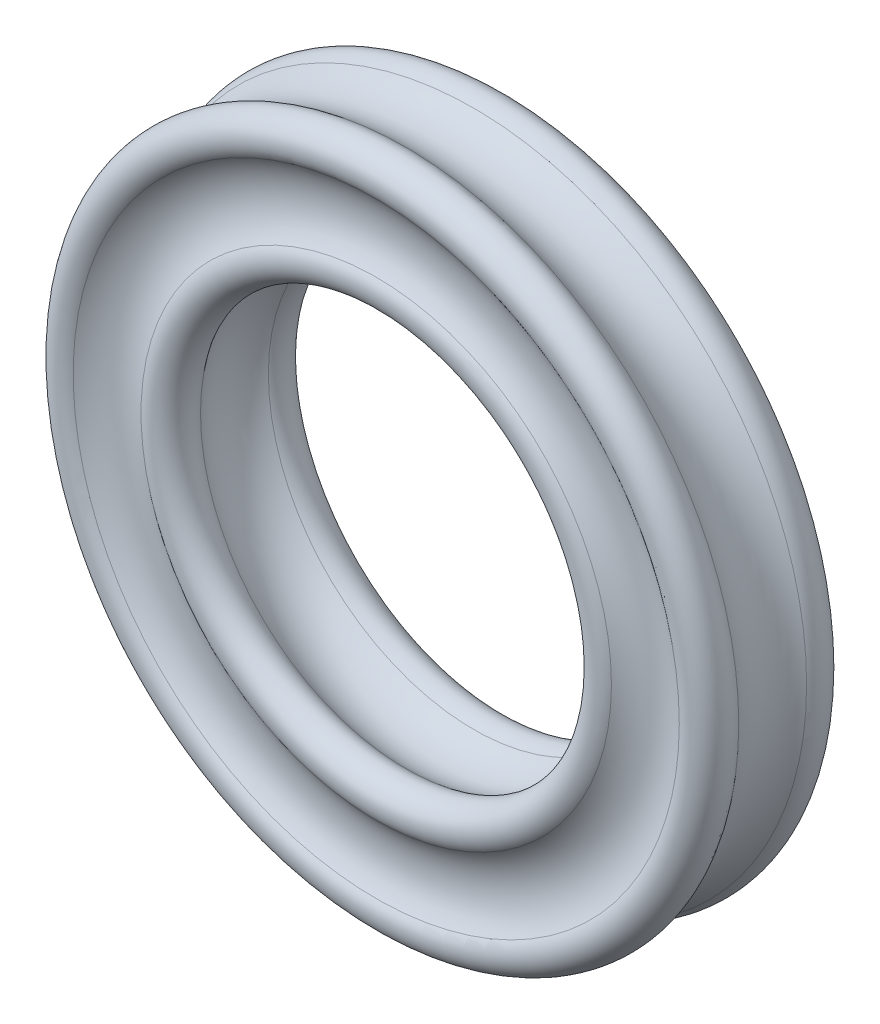
ISO-10303-21;
HEADER;
FILE_DESCRIPTION(('STEP AP214'),'2;1');
FILE_NAME('part.step','',(''),(''),'','','');
FILE_SCHEMA(('AUTOMOTIVE_DESIGN { 1 0 10303 214 1 1 1 1 }'));
ENDSEC;
DATA;
#1=APPLICATION_CONTEXT('core data for automotive mechanical design processes');
#2=APPLICATION_PROTOCOL_DEFINITION('international standard','automotive_design',2000,#1);
#3=PRODUCT_CONTEXT('',#1,'mechanical');
#4=PRODUCT('Part','Part','',(#3));
#5=PRODUCT_RELATED_PRODUCT_CATEGORY('part','',(#4));
#6=PRODUCT_DEFINITION_FORMATION('','',#4);
#7=PRODUCT_DEFINITION_CONTEXT('part definition',#1,'design');
#8=PRODUCT_DEFINITION('design','',#6,#7);
#9=PRODUCT_DEFINITION_SHAPE('','',#8);
#10=(LENGTH_UNIT() NAMED_UNIT(*) SI_UNIT(.MILLI.,.METRE.));
#11=(NAMED_UNIT(*) PLANE_ANGLE_UNIT() SI_UNIT($,.RADIAN.));
#12=(NAMED_UNIT(*) SI_UNIT($,.STERADIAN.) SOLID_ANGLE_UNIT());
#13=UNCERTAINTY_MEASURE_WITH_UNIT(LENGTH_MEASURE(1.E-05),#10,'distance_accuracy_value','');
#14=(GEOMETRIC_REPRESENTATION_CONTEXT(3) GLOBAL_UNCERTAINTY_ASSIGNED_CONTEXT((#13)) GLOBAL_UNIT_ASSIGNED_CONTEXT((#10,
#11,#12)) REPRESENTATION_CONTEXT('',''));
#15=CARTESIAN_POINT('',(0.,0.,0.));
#16=DIRECTION('',(0.,0.,1.));
#17=DIRECTION('',(1.,0.,0.));
#18=AXIS2_PLACEMENT_3D('',#15,#16,#17);
#19=CARTESIAN_POINT('',(0.,0.,-1.97238052947636));
#20=DIRECTION('',(0.,0.,1.));
#21=DIRECTION('',(1.,0.,0.));
#22=AXIS2_PLACEMENT_3D('',#19,#20,#21);
#23=TOROIDAL_SURFACE('',#22,5.1,1.);
#24=CARTESIAN_POINT('',(0.,0.,-1.20639443699325));
#25=DIRECTION('',(0.,0.,1.));
#26=DIRECTION('',(1.,0.,0.));
#27=AXIS2_PLACEMENT_3D('',#24,#25,#26);
#28=CIRCLE('',#27,5.74285714285714);
#29=CARTESIAN_POINT('',(5.74285714285714,0.,-1.20639443699325));
#30=VERTEX_POINT('',#29);
#31=EDGE_CURVE('E58',#30,#30,#28,.T.);
#32=ORIENTED_EDGE('',*,*,#31,.F.);
#33=EDGE_LOOP('',(#32));
#34=FACE_BOUND('',#33,.T.);
#35=CARTESIAN_POINT('',(0.,0.,-1.20639443699325));
#36=DIRECTION('',(0.,0.,1.));
#37=DIRECTION('',(1.,0.,0.));
#38=AXIS2_PLACEMENT_3D('',#35,#36,#37);
#39=CIRCLE('',#38,4.45714285714286);
#40=CARTESIAN_POINT('',(4.45714285714286,0.,-1.20639443699325));
#41=VERTEX_POINT('',#40);
#42=EDGE_CURVE('E55',#41,#41,#39,.T.);
#43=ORIENTED_EDGE('',*,*,#42,.T.);
#44=EDGE_LOOP('',(#43));
#45=FACE_BOUND('',#44,.T.);
#46=ADVANCED_FACE('F32',(#34,#45),#23,.F.);
#47=CARTESIAN_POINT('',(0.,0.,-0.9));
#48=DIRECTION('',(0.,0.,1.));
#49=DIRECTION('',(1.,0.,0.));
#50=AXIS2_PLACEMENT_3D('',#47,#48,#49);
#51=TOROIDAL_SURFACE('',#50,6.,0.4);
#52=ORIENTED_EDGE('',*,*,#31,.T.);
#53=EDGE_LOOP('',(#52));
#54=FACE_BOUND('',#53,.T.);
#55=CARTESIAN_POINT('',(0.,0.,-0.642857142857143));
#56=DIRECTION('',(0.,0.,1.));
#57=DIRECTION('',(1.,0.,0.));
#58=AXIS2_PLACEMENT_3D('',#55,#56,#57);
#59=CIRCLE('',#58,6.30639443699324);
#60=CARTESIAN_POINT('',(6.30639443699324,0.,-0.642857142857143));
#61=VERTEX_POINT('',#60);
#62=EDGE_CURVE('E61',#61,#61,#59,.T.);
#63=ORIENTED_EDGE('',*,*,#62,.F.);
#64=EDGE_LOOP('',(#63));
#65=FACE_BOUND('',#64,.T.);
#66=ADVANCED_FACE('F67',(#54,#65),#51,.T.);
#67=CARTESIAN_POINT('',(0.,0.,0.));
#68=DIRECTION('',(0.,0.,1.));
#69=DIRECTION('',(1.,0.,0.));
#70=AXIS2_PLACEMENT_3D('',#67,#68,#69);
#71=TOROIDAL_SURFACE('',#70,7.07238052947636,1.);
#72=ORIENTED_EDGE('',*,*,#62,.T.);
#73=EDGE_LOOP('',(#72));
#74=FACE_BOUND('',#73,.T.);
#75=CARTESIAN_POINT('',(0.,0.,0.642857142857143));
#76=DIRECTION('',(0.,0.,1.));
#77=DIRECTION('',(1.,0.,0.));
#78=AXIS2_PLACEMENT_3D('',#75,#76,#77);
#79=CIRCLE('',#78,6.30639443699325);
#80=CARTESIAN_POINT('',(6.30639443699325,0.,0.642857142857143));
#81=VERTEX_POINT('',#80);
#82=EDGE_CURVE('E10',#81,#81,#79,.T.);
#83=ORIENTED_EDGE('',*,*,#82,.F.);
#84=EDGE_LOOP('',(#83));
#85=FACE_BOUND('',#84,.T.);
#86=ADVANCED_FACE('F34',(#74,#85),#71,.F.);
#87=CARTESIAN_POINT('',(0.,0.,-0.900000000000001));
#88=DIRECTION('',(0.,0.,1.));
#89=DIRECTION('',(1.,0.,0.));
#90=AXIS2_PLACEMENT_3D('',#87,#88,#89);
#91=TOROIDAL_SURFACE('',#90,4.2,0.4);
#92=ORIENTED_EDGE('',*,*,#42,.F.);
#93=EDGE_LOOP('',(#92));
#94=FACE_BOUND('',#93,.T.);
#95=CARTESIAN_POINT('',(0.,0.,-0.642857142857143));
#96=DIRECTION('',(0.,0.,1.));
#97=DIRECTION('',(1.,0.,0.));
#98=AXIS2_PLACEMENT_3D('',#95,#96,#97);
#99=CIRCLE('',#98,3.89360556300675);
#100=CARTESIAN_POINT('',(3.89360556300675,0.,-0.642857142857143));
#101=VERTEX_POINT('',#100);
#102=EDGE_CURVE('E52',#101,#101,#99,.T.);
#103=ORIENTED_EDGE('',*,*,#102,.T.);
#104=EDGE_LOOP('',(#103));
#105=FACE_BOUND('',#104,.T.);
#106=ADVANCED_FACE('F75',(#94,#105),#91,.T.);
#107=CARTESIAN_POINT('',(0.,0.,0.));
#108=DIRECTION('',(0.,0.,1.));
#109=DIRECTION('',(1.,0.,0.));
#110=AXIS2_PLACEMENT_3D('',#107,#108,#109);
#111=TOROIDAL_SURFACE('',#110,3.12761947052364,1.);
#112=ORIENTED_EDGE('',*,*,#102,.F.);
#113=EDGE_LOOP('',(#112));
#114=FACE_BOUND('',#113,.T.);
#115=CARTESIAN_POINT('',(0.,0.,0.642857142857143));
#116=DIRECTION('',(0.,0.,1.));
#117=DIRECTION('',(1.,0.,0.));
#118=AXIS2_PLACEMENT_3D('',#115,#116,#117);
#119=CIRCLE('',#118,3.89360556300675);
#120=CARTESIAN_POINT('',(3.89360556300675,0.,0.642857142857143));
#121=VERTEX_POINT('',#120);
#122=EDGE_CURVE('E47',#121,#121,#119,.T.);
#123=ORIENTED_EDGE('',*,*,#122,.T.);
#124=EDGE_LOOP('',(#123));
#125=FACE_BOUND('',#124,.T.);
#126=ADVANCED_FACE('F81',(#114,#125),#111,.F.);
#127=CARTESIAN_POINT('',(0.,0.,0.9));
#128=DIRECTION('',(0.,0.,1.));
#129=DIRECTION('',(1.,0.,0.));
#130=AXIS2_PLACEMENT_3D('',#127,#128,#129);
#131=TOROIDAL_SURFACE('',#130,4.2,0.4);
#132=ORIENTED_EDGE('',*,*,#122,.F.);
#133=EDGE_LOOP('',(#132));
#134=FACE_BOUND('',#133,.T.);
#135=CARTESIAN_POINT('',(0.,0.,1.20639443699325));
#136=DIRECTION('',(0.,0.,1.));
#137=DIRECTION('',(1.,0.,0.));
#138=AXIS2_PLACEMENT_3D('',#135,#136,#137);
#139=CIRCLE('',#138,4.45714285714286);
#140=CARTESIAN_POINT('',(4.45714285714286,0.,1.20639443699325));
#141=VERTEX_POINT('',#140);
#142=EDGE_CURVE('E43',#141,#141,#139,.T.);
#143=ORIENTED_EDGE('',*,*,#142,.T.);
#144=EDGE_LOOP('',(#143));
#145=FACE_BOUND('',#144,.T.);
#146=ADVANCED_FACE('F85',(#134,#145),#131,.T.);
#147=CARTESIAN_POINT('',(0.,0.,1.97238052947636));
#148=DIRECTION('',(0.,0.,1.));
#149=DIRECTION('',(1.,0.,0.));
#150=AXIS2_PLACEMENT_3D('',#147,#148,#149);
#151=TOROIDAL_SURFACE('',#150,5.1,1.);
#152=CARTESIAN_POINT('',(0.,0.,1.20639443699325));
#153=DIRECTION('',(0.,0.,1.));
#154=DIRECTION('',(1.,0.,0.));
#155=AXIS2_PLACEMENT_3D('',#152,#153,#154);
#156=CIRCLE('',#155,5.74285714285714);
#157=CARTESIAN_POINT('',(5.74285714285714,0.,1.20639443699325));
#158=VERTEX_POINT('',#157);
#159=EDGE_CURVE('E39',#158,#158,#156,.T.);
#160=ORIENTED_EDGE('',*,*,#159,.T.);
#161=EDGE_LOOP('',(#160));
#162=FACE_BOUND('',#161,.T.);
#163=ORIENTED_EDGE('',*,*,#142,.F.);
#164=EDGE_LOOP('',(#163));
#165=FACE_BOUND('',#164,.T.);
#166=ADVANCED_FACE('F89',(#162,#165),#151,.F.);
#167=CARTESIAN_POINT('',(0.,0.,0.9));
#168=DIRECTION('',(0.,0.,1.));
#169=DIRECTION('',(1.,0.,0.));
#170=AXIS2_PLACEMENT_3D('',#167,#168,#169);
#171=TOROIDAL_SURFACE('',#170,6.,0.4);
#172=ORIENTED_EDGE('',*,*,#159,.F.);
#173=EDGE_LOOP('',(#172));
#174=FACE_BOUND('',#173,.T.);
#175=ORIENTED_EDGE('',*,*,#82,.T.);
#176=EDGE_LOOP('',(#175));
#177=FACE_BOUND('',#176,.T.);
#178=ADVANCED_FACE('F92',(#174,#177),#171,.T.);
#179=CLOSED_SHELL('',(#46,#66,#86,#106,#126,#146,#166,#178));
#180=MANIFOLD_SOLID_BREP('B2',#179);
#181=ADVANCED_BREP_SHAPE_REPRESENTATION('',(#18,#180),#14);
#182=SHAPE_DEFINITION_REPRESENTATION(#9,#181);
ENDSEC;
END-ISO-10303-21;
